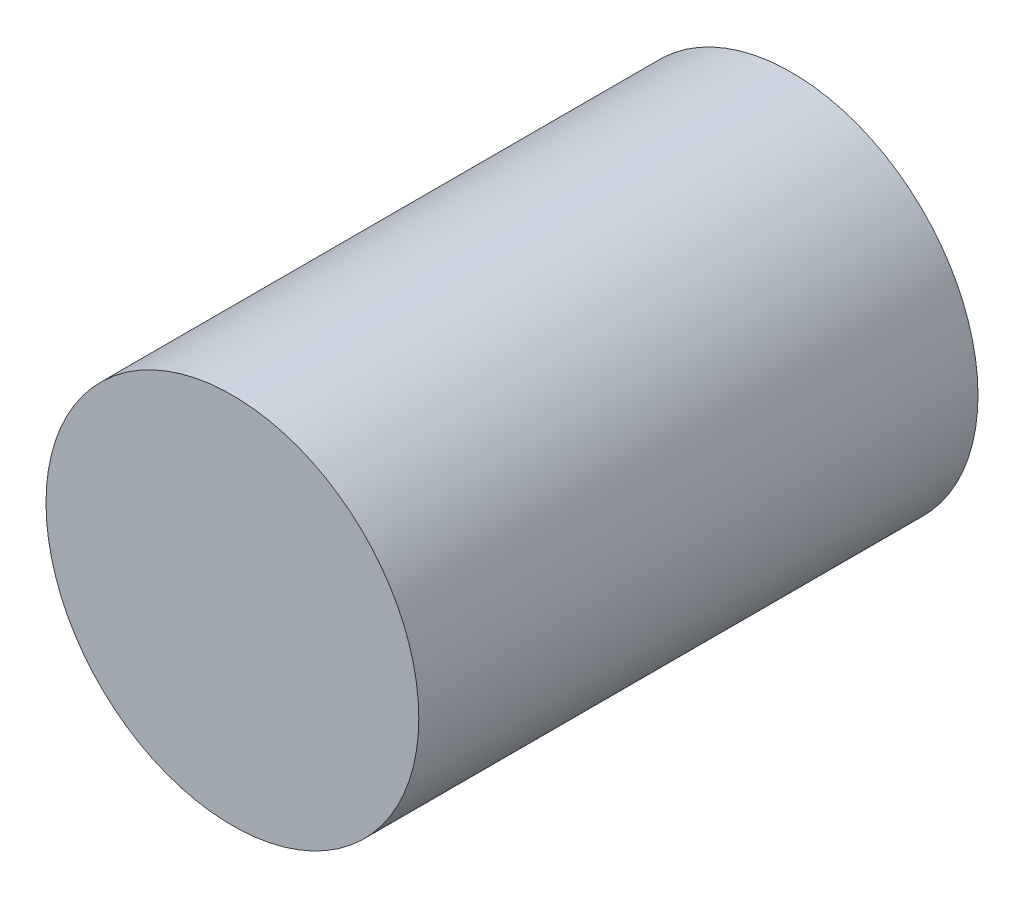
ISO-10303-21;
HEADER;
FILE_DESCRIPTION(('STEP AP214'),'2;1');
FILE_NAME('part.step','',(''),(''),'','','');
FILE_SCHEMA(('AUTOMOTIVE_DESIGN { 1 0 10303 214 1 1 1 1 }'));
ENDSEC;
DATA;
#1=APPLICATION_CONTEXT('core data for automotive mechanical design processes');
#2=APPLICATION_PROTOCOL_DEFINITION('international standard','automotive_design',2000,#1);
#3=PRODUCT_CONTEXT('',#1,'mechanical');
#4=PRODUCT('Part','Part','',(#3));
#5=PRODUCT_RELATED_PRODUCT_CATEGORY('part','',(#4));
#6=PRODUCT_DEFINITION_FORMATION('','',#4);
#7=PRODUCT_DEFINITION_CONTEXT('part definition',#1,'design');
#8=PRODUCT_DEFINITION('design','',#6,#7);
#9=PRODUCT_DEFINITION_SHAPE('','',#8);
#10=(LENGTH_UNIT() NAMED_UNIT(*) SI_UNIT(.MILLI.,.METRE.));
#11=(NAMED_UNIT(*) PLANE_ANGLE_UNIT() SI_UNIT($,.RADIAN.));
#12=(NAMED_UNIT(*) SI_UNIT($,.STERADIAN.) SOLID_ANGLE_UNIT());
#13=UNCERTAINTY_MEASURE_WITH_UNIT(LENGTH_MEASURE(1.E-05),#10,'distance_accuracy_value','');
#14=(GEOMETRIC_REPRESENTATION_CONTEXT(3) GLOBAL_UNCERTAINTY_ASSIGNED_CONTEXT((#13)) GLOBAL_UNIT_ASSIGNED_CONTEXT((#10,
#11,#12)) REPRESENTATION_CONTEXT('',''));
#15=CARTESIAN_POINT('',(0.,0.,0.));
#16=DIRECTION('',(0.,0.,1.));
#17=DIRECTION('',(1.,0.,0.));
#18=AXIS2_PLACEMENT_3D('',#15,#16,#17);
#19=CARTESIAN_POINT('',(0.,0.,0.));
#20=DIRECTION('',(0.,0.,1.));
#21=DIRECTION('',(1.,0.,0.));
#22=AXIS2_PLACEMENT_3D('',#19,#20,#21);
#23=PLANE('',#22);
#24=CARTESIAN_POINT('',(0.,0.,0.));
#25=DIRECTION('',(0.,0.,-1.));
#26=DIRECTION('',(-1.,0.,0.));
#27=AXIS2_PLACEMENT_3D('',#24,#25,#26);
#28=CIRCLE('',#27,0.3);
#29=CARTESIAN_POINT('',(-0.3,0.,0.));
#30=VERTEX_POINT('',#29);
#31=EDGE_CURVE('E18',#30,#30,#28,.F.);
#32=ORIENTED_EDGE('',*,*,#31,.F.);
#33=EDGE_LOOP('',(#32));
#34=FACE_BOUND('',#33,.T.);
#35=ADVANCED_FACE('F15',(#34),#23,.F.);
#36=CARTESIAN_POINT('',(0.,0.,0.9));
#37=DIRECTION('',(0.,0.,1.));
#38=DIRECTION('',(1.,0.,0.));
#39=AXIS2_PLACEMENT_3D('',#36,#37,#38);
#40=PLANE('',#39);
#41=CARTESIAN_POINT('',(0.,0.,0.9));
#42=DIRECTION('',(0.,0.,-1.));
#43=DIRECTION('',(-1.,0.,0.));
#44=AXIS2_PLACEMENT_3D('',#41,#42,#43);
#45=CIRCLE('',#44,0.3);
#46=CARTESIAN_POINT('',(-0.3,0.,0.9));
#47=VERTEX_POINT('',#46);
#48=EDGE_CURVE('E10',#47,#47,#45,.T.);
#49=ORIENTED_EDGE('',*,*,#48,.F.);
#50=EDGE_LOOP('',(#49));
#51=FACE_BOUND('',#50,.T.);
#52=ADVANCED_FACE('F30',(#51),#40,.T.);
#53=CARTESIAN_POINT('',(0.,0.,0.));
#54=DIRECTION('',(0.,0.,-1.));
#55=DIRECTION('',(-1.,0.,0.));
#56=AXIS2_PLACEMENT_3D('',#53,#54,#55);
#57=CYLINDRICAL_SURFACE('',#56,0.3);
#58=ORIENTED_EDGE('',*,*,#48,.T.);
#59=EDGE_LOOP('',(#58));
#60=FACE_BOUND('',#59,.T.);
#61=ORIENTED_EDGE('',*,*,#31,.T.);
#62=EDGE_LOOP('',(#61));
#63=FACE_BOUND('',#62,.T.);
#64=ADVANCED_FACE('F27',(#60,#63),#57,.T.);
#65=CLOSED_SHELL('',(#35,#52,#64));
#66=MANIFOLD_SOLID_BREP('B1',#65);
#67=ADVANCED_BREP_SHAPE_REPRESENTATION('',(#18,#66),#14);
#68=SHAPE_DEFINITION_REPRESENTATION(#9,#67);
ENDSEC;
END-ISO-10303-21;
